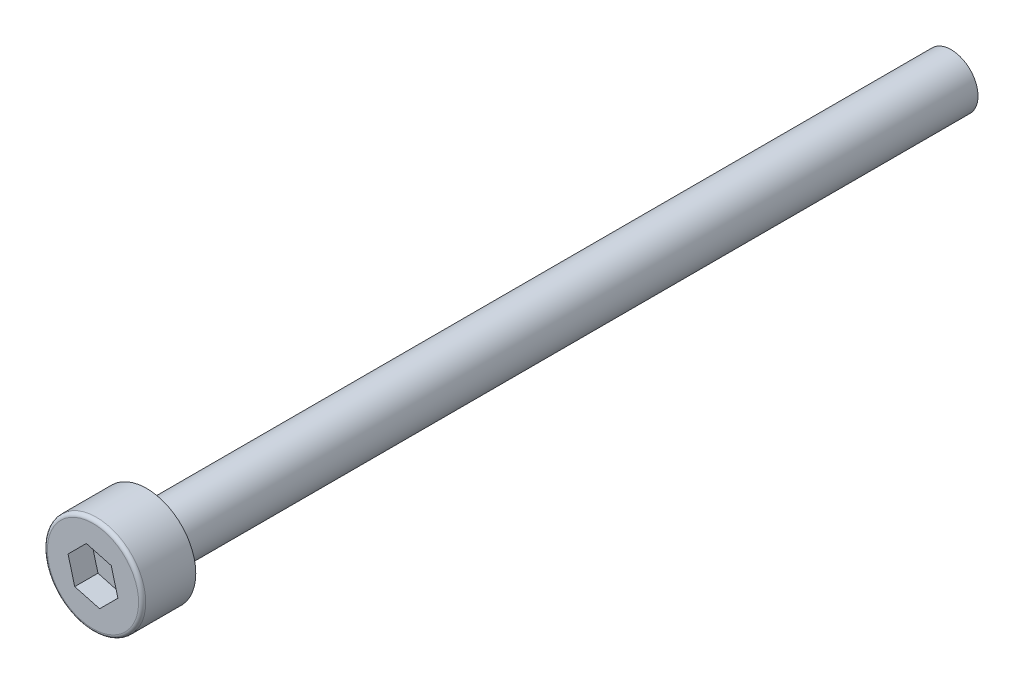
ISO-10303-21;
HEADER;
FILE_DESCRIPTION(('STEP AP214'),'2;1');
FILE_NAME('part.step','',(''),(''),'','','');
FILE_SCHEMA(('AUTOMOTIVE_DESIGN { 1 0 10303 214 1 1 1 1 }'));
ENDSEC;
DATA;
#1=APPLICATION_CONTEXT('core data for automotive mechanical design processes');
#2=APPLICATION_PROTOCOL_DEFINITION('international standard','automotive_design',2000,#1);
#3=PRODUCT_CONTEXT('',#1,'mechanical');
#4=PRODUCT('Part','Part','',(#3));
#5=PRODUCT_RELATED_PRODUCT_CATEGORY('part','',(#4));
#6=PRODUCT_DEFINITION_FORMATION('','',#4);
#7=PRODUCT_DEFINITION_CONTEXT('part definition',#1,'design');
#8=PRODUCT_DEFINITION('design','',#6,#7);
#9=PRODUCT_DEFINITION_SHAPE('','',#8);
#10=(LENGTH_UNIT() NAMED_UNIT(*) SI_UNIT(.MILLI.,.METRE.));
#11=(NAMED_UNIT(*) PLANE_ANGLE_UNIT() SI_UNIT($,.RADIAN.));
#12=(NAMED_UNIT(*) SI_UNIT($,.STERADIAN.) SOLID_ANGLE_UNIT());
#13=UNCERTAINTY_MEASURE_WITH_UNIT(LENGTH_MEASURE(1.E-05),#10,'distance_accuracy_value','');
#14=(GEOMETRIC_REPRESENTATION_CONTEXT(3) GLOBAL_UNCERTAINTY_ASSIGNED_CONTEXT((#13)) GLOBAL_UNIT_ASSIGNED_CONTEXT((#10,
#11,#12)) REPRESENTATION_CONTEXT('',''));
#15=CARTESIAN_POINT('',(0.,0.,0.));
#16=DIRECTION('',(0.,0.,1.));
#17=DIRECTION('',(1.,0.,0.));
#18=AXIS2_PLACEMENT_3D('',#15,#16,#17);
#19=CARTESIAN_POINT('',(0.,0.,0.));
#20=DIRECTION('',(0.,0.,1.));
#21=DIRECTION('',(1.,0.,0.));
#22=AXIS2_PLACEMENT_3D('',#19,#20,#21);
#23=PLANE('',#22);
#24=CARTESIAN_POINT('',(0.,0.,0.));
#25=DIRECTION('',(0.,0.,1.));
#26=DIRECTION('',(1.,0.,0.));
#27=AXIS2_PLACEMENT_3D('',#24,#25,#26);
#28=CIRCLE('',#27,2.75);
#29=CARTESIAN_POINT('',(2.75,0.,0.));
#30=VERTEX_POINT('',#29);
#31=EDGE_CURVE('E137',#30,#30,#28,.T.);
#32=ORIENTED_EDGE('',*,*,#31,.F.);
#33=EDGE_LOOP('',(#32));
#34=FACE_BOUND('',#33,.T.);
#35=CARTESIAN_POINT('',(0.,0.,0.));
#36=DIRECTION('',(0.,0.,1.));
#37=DIRECTION('',(1.,0.,0.));
#38=AXIS2_PLACEMENT_3D('',#35,#36,#37);
#39=CIRCLE('',#38,1.5);
#40=CARTESIAN_POINT('',(1.5,0.,0.));
#41=VERTEX_POINT('',#40);
#42=EDGE_CURVE('E145',#41,#41,#39,.F.);
#43=ORIENTED_EDGE('',*,*,#42,.F.);
#44=EDGE_LOOP('',(#43));
#45=FACE_BOUND('',#44,.T.);
#46=ADVANCED_FACE('F34',(#34,#45),#23,.F.);
#47=CARTESIAN_POINT('',(0.,0.,3.));
#48=DIRECTION('',(0.,0.,-1.));
#49=DIRECTION('',(-1.,0.,0.));
#50=AXIS2_PLACEMENT_3D('',#47,#48,#49);
#51=CYLINDRICAL_SURFACE('',#50,2.75);
#52=CARTESIAN_POINT('',(0.,0.,2.8));
#53=DIRECTION('',(0.,0.,1.));
#54=DIRECTION('',(1.,0.,0.));
#55=AXIS2_PLACEMENT_3D('',#52,#53,#54);
#56=CIRCLE('',#55,2.75);
#57=CARTESIAN_POINT('',(2.75,0.,2.8));
#58=VERTEX_POINT('',#57);
#59=EDGE_CURVE('E11',#58,#58,#56,.F.);
#60=ORIENTED_EDGE('',*,*,#59,.T.);
#61=EDGE_LOOP('',(#60));
#62=FACE_BOUND('',#61,.T.);
#63=ORIENTED_EDGE('',*,*,#31,.T.);
#64=EDGE_LOOP('',(#63));
#65=FACE_BOUND('',#64,.T.);
#66=ADVANCED_FACE('F164',(#62,#65),#51,.T.);
#67=CARTESIAN_POINT('',(0.,0.,3.));
#68=DIRECTION('',(0.,0.,1.));
#69=DIRECTION('',(1.,0.,0.));
#70=AXIS2_PLACEMENT_3D('',#67,#68,#69);
#71=PLANE('',#70);
#72=CARTESIAN_POINT('',(0.,0.,3.));
#73=DIRECTION('',(0.,0.,1.));
#74=DIRECTION('',(1.,0.,0.));
#75=AXIS2_PLACEMENT_3D('',#72,#73,#74);
#76=CIRCLE('',#75,2.55);
#77=CARTESIAN_POINT('',(2.55,0.,3.));
#78=VERTEX_POINT('',#77);
#79=EDGE_CURVE('E42',#78,#78,#76,.T.);
#80=ORIENTED_EDGE('',*,*,#79,.T.);
#81=EDGE_LOOP('',(#80));
#82=FACE_BOUND('',#81,.T.);
#83=DIRECTION('',(0.258819045102521,-0.965925826289068,0.));
#84=VECTOR('',#83,1.);
#85=CARTESIAN_POINT('',(-1.39419383956301,0.373573113403356,3.));
#86=LINE('',#85,#84);
#87=CARTESIAN_POINT('',(-1.39419383956301,0.373573113403356,3.));
#88=VERTEX_POINT('',#87);
#89=CARTESIAN_POINT('',(-1.02062072615966,-1.02062072615966,3.));
#90=VERTEX_POINT('',#89);
#91=EDGE_CURVE('E49',#88,#90,#86,.T.);
#92=ORIENTED_EDGE('',*,*,#91,.F.);
#93=DIRECTION('',(-0.707106781186548,-0.707106781186548,0.));
#94=VECTOR('',#93,1.);
#95=CARTESIAN_POINT('',(-0.373573113403355,1.39419383956301,3.));
#96=LINE('',#95,#94);
#97=CARTESIAN_POINT('',(-0.373573113403355,1.39419383956301,3.));
#98=VERTEX_POINT('',#97);
#99=EDGE_CURVE('E133',#98,#88,#96,.T.);
#100=ORIENTED_EDGE('',*,*,#99,.F.);
#101=DIRECTION('',(-0.965925826289068,0.258819045102521,0.));
#102=VECTOR('',#101,1.);
#103=CARTESIAN_POINT('',(1.02062072615966,1.02062072615966,3.));
#104=LINE('',#103,#102);
#105=CARTESIAN_POINT('',(1.02062072615966,1.02062072615966,3.));
#106=VERTEX_POINT('',#105);
#107=EDGE_CURVE('E131',#106,#98,#104,.T.);
#108=ORIENTED_EDGE('',*,*,#107,.F.);
#109=DIRECTION('',(-0.258819045102521,0.965925826289068,0.));
#110=VECTOR('',#109,1.);
#111=CARTESIAN_POINT('',(1.39419383956301,-0.373573113403355,3.));
#112=LINE('',#111,#110);
#113=CARTESIAN_POINT('',(1.39419383956301,-0.373573113403355,3.));
#114=VERTEX_POINT('',#113);
#115=EDGE_CURVE('E97',#114,#106,#112,.T.);
#116=ORIENTED_EDGE('',*,*,#115,.F.);
#117=DIRECTION('',(0.707106781186548,0.707106781186548,0.));
#118=VECTOR('',#117,1.);
#119=CARTESIAN_POINT('',(0.373573113403355,-1.39419383956301,3.));
#120=LINE('',#119,#118);
#121=CARTESIAN_POINT('',(0.373573113403355,-1.39419383956301,3.));
#122=VERTEX_POINT('',#121);
#123=EDGE_CURVE('E127',#122,#114,#120,.T.);
#124=ORIENTED_EDGE('',*,*,#123,.F.);
#125=DIRECTION('',(0.965925826289068,-0.258819045102521,0.));
#126=VECTOR('',#125,1.);
#127=CARTESIAN_POINT('',(-1.02062072615966,-1.02062072615966,3.));
#128=LINE('',#127,#126);
#129=EDGE_CURVE('E123',#90,#122,#128,.T.);
#130=ORIENTED_EDGE('',*,*,#129,.F.);
#131=EDGE_LOOP('',(#92,#100,#108,#116,#124,#130));
#132=FACE_BOUND('',#131,.T.);
#133=ADVANCED_FACE('F150',(#82,#132),#71,.T.);
#134=CARTESIAN_POINT('',(-1.39419383956301,0.373573113403356,1.7));
#135=DIRECTION('',(-0.965925826289068,-0.258819045102521,0.));
#136=DIRECTION('',(0.258819045102521,-0.965925826289068,0.));
#137=AXIS2_PLACEMENT_3D('',#134,#135,#136);
#138=PLANE('',#137);
#139=ORIENTED_EDGE('',*,*,#91,.T.);
#140=DIRECTION('',(0.,0.,1.));
#141=VECTOR('',#140,1.);
#142=CARTESIAN_POINT('',(-1.02062072615966,-1.02062072615966,1.7));
#143=LINE('',#142,#141);
#144=CARTESIAN_POINT('',(-1.02062072615966,-1.02062072615966,1.7));
#145=VERTEX_POINT('',#144);
#146=EDGE_CURVE('E79',#145,#90,#143,.T.);
#147=ORIENTED_EDGE('',*,*,#146,.F.);
#148=DIRECTION('',(0.258819045102521,-0.965925826289068,0.));
#149=VECTOR('',#148,1.);
#150=CARTESIAN_POINT('',(-1.39419383956301,0.373573113403356,1.7));
#151=LINE('',#150,#149);
#152=CARTESIAN_POINT('',(-1.39419383956301,0.373573113403356,1.7));
#153=VERTEX_POINT('',#152);
#154=EDGE_CURVE('E135',#153,#145,#151,.T.);
#155=ORIENTED_EDGE('',*,*,#154,.F.);
#156=DIRECTION('',(0.,0.,1.));
#157=VECTOR('',#156,1.);
#158=CARTESIAN_POINT('',(-1.39419383956301,0.373573113403356,1.7));
#159=LINE('',#158,#157);
#160=EDGE_CURVE('E57',#153,#88,#159,.T.);
#161=ORIENTED_EDGE('',*,*,#160,.T.);
#162=EDGE_LOOP('',(#139,#147,#155,#161));
#163=FACE_BOUND('',#162,.T.);
#164=ADVANCED_FACE('F176',(#163),#138,.F.);
#165=CARTESIAN_POINT('',(-0.373573113403355,1.39419383956301,1.7));
#166=DIRECTION('',(-0.707106781186548,0.707106781186548,0.));
#167=DIRECTION('',(-0.707106781186548,-0.707106781186548,0.));
#168=AXIS2_PLACEMENT_3D('',#165,#166,#167);
#169=PLANE('',#168);
#170=ORIENTED_EDGE('',*,*,#99,.T.);
#171=ORIENTED_EDGE('',*,*,#160,.F.);
#172=DIRECTION('',(-0.707106781186548,-0.707106781186548,0.));
#173=VECTOR('',#172,1.);
#174=CARTESIAN_POINT('',(-0.373573113403355,1.39419383956301,1.7));
#175=LINE('',#174,#173);
#176=CARTESIAN_POINT('',(-0.373573113403355,1.39419383956301,1.7));
#177=VERTEX_POINT('',#176);
#178=EDGE_CURVE('E109',#177,#153,#175,.T.);
#179=ORIENTED_EDGE('',*,*,#178,.F.);
#180=DIRECTION('',(0.,0.,1.));
#181=VECTOR('',#180,1.);
#182=CARTESIAN_POINT('',(-0.373573113403355,1.39419383956301,1.7));
#183=LINE('',#182,#181);
#184=EDGE_CURVE('E101',#177,#98,#183,.T.);
#185=ORIENTED_EDGE('',*,*,#184,.T.);
#186=EDGE_LOOP('',(#170,#171,#179,#185));
#187=FACE_BOUND('',#186,.T.);
#188=ADVANCED_FACE('F179',(#187),#169,.F.);
#189=CARTESIAN_POINT('',(1.02062072615966,1.02062072615966,1.7));
#190=DIRECTION('',(0.258819045102521,0.965925826289068,0.));
#191=DIRECTION('',(-0.965925826289068,0.258819045102521,0.));
#192=AXIS2_PLACEMENT_3D('',#189,#190,#191);
#193=PLANE('',#192);
#194=ORIENTED_EDGE('',*,*,#107,.T.);
#195=ORIENTED_EDGE('',*,*,#184,.F.);
#196=DIRECTION('',(-0.965925826289068,0.258819045102521,0.));
#197=VECTOR('',#196,1.);
#198=CARTESIAN_POINT('',(1.02062072615966,1.02062072615966,1.7));
#199=LINE('',#198,#197);
#200=CARTESIAN_POINT('',(1.02062072615966,1.02062072615966,1.7));
#201=VERTEX_POINT('',#200);
#202=EDGE_CURVE('E105',#201,#177,#199,.T.);
#203=ORIENTED_EDGE('',*,*,#202,.F.);
#204=DIRECTION('',(0.,0.,1.));
#205=VECTOR('',#204,1.);
#206=CARTESIAN_POINT('',(1.02062072615966,1.02062072615966,1.7));
#207=LINE('',#206,#205);
#208=EDGE_CURVE('E90',#201,#106,#207,.T.);
#209=ORIENTED_EDGE('',*,*,#208,.T.);
#210=EDGE_LOOP('',(#194,#195,#203,#209));
#211=FACE_BOUND('',#210,.T.);
#212=ADVANCED_FACE('F106',(#211),#193,.F.);
#213=CARTESIAN_POINT('',(1.39419383956301,-0.373573113403355,1.7));
#214=DIRECTION('',(0.965925826289068,0.258819045102521,0.));
#215=DIRECTION('',(-0.258819045102521,0.965925826289068,0.));
#216=AXIS2_PLACEMENT_3D('',#213,#214,#215);
#217=PLANE('',#216);
#218=ORIENTED_EDGE('',*,*,#115,.T.);
#219=ORIENTED_EDGE('',*,*,#208,.F.);
#220=DIRECTION('',(-0.258819045102521,0.965925826289068,0.));
#221=VECTOR('',#220,1.);
#222=CARTESIAN_POINT('',(1.39419383956301,-0.373573113403355,1.7));
#223=LINE('',#222,#221);
#224=CARTESIAN_POINT('',(1.39419383956301,-0.373573113403355,1.7));
#225=VERTEX_POINT('',#224);
#226=EDGE_CURVE('E94',#225,#201,#223,.T.);
#227=ORIENTED_EDGE('',*,*,#226,.F.);
#228=DIRECTION('',(0.,0.,1.));
#229=VECTOR('',#228,1.);
#230=CARTESIAN_POINT('',(1.39419383956301,-0.373573113403355,1.7));
#231=LINE('',#230,#229);
#232=EDGE_CURVE('E102',#225,#114,#231,.T.);
#233=ORIENTED_EDGE('',*,*,#232,.T.);
#234=EDGE_LOOP('',(#218,#219,#227,#233));
#235=FACE_BOUND('',#234,.T.);
#236=ADVANCED_FACE('F92',(#235),#217,.F.);
#237=CARTESIAN_POINT('',(0.373573113403355,-1.39419383956301,1.7));
#238=DIRECTION('',(0.707106781186548,-0.707106781186548,0.));
#239=DIRECTION('',(0.707106781186548,0.707106781186548,0.));
#240=AXIS2_PLACEMENT_3D('',#237,#238,#239);
#241=PLANE('',#240);
#242=ORIENTED_EDGE('',*,*,#123,.T.);
#243=ORIENTED_EDGE('',*,*,#232,.F.);
#244=DIRECTION('',(0.707106781186548,0.707106781186548,0.));
#245=VECTOR('',#244,1.);
#246=CARTESIAN_POINT('',(0.373573113403355,-1.39419383956301,1.7));
#247=LINE('',#246,#245);
#248=CARTESIAN_POINT('',(0.373573113403355,-1.39419383956301,1.7));
#249=VERTEX_POINT('',#248);
#250=EDGE_CURVE('E115',#249,#225,#247,.T.);
#251=ORIENTED_EDGE('',*,*,#250,.F.);
#252=DIRECTION('',(0.,0.,1.));
#253=VECTOR('',#252,1.);
#254=CARTESIAN_POINT('',(0.373573113403355,-1.39419383956301,1.7));
#255=LINE('',#254,#253);
#256=EDGE_CURVE('E140',#249,#122,#255,.T.);
#257=ORIENTED_EDGE('',*,*,#256,.T.);
#258=EDGE_LOOP('',(#242,#243,#251,#257));
#259=FACE_BOUND('',#258,.T.);
#260=ADVANCED_FACE('F183',(#259),#241,.F.);
#261=CARTESIAN_POINT('',(-1.02062072615966,-1.02062072615966,1.7));
#262=DIRECTION('',(-0.258819045102521,-0.965925826289068,0.));
#263=DIRECTION('',(0.965925826289068,-0.258819045102521,0.));
#264=AXIS2_PLACEMENT_3D('',#261,#262,#263);
#265=PLANE('',#264);
#266=ORIENTED_EDGE('',*,*,#129,.T.);
#267=ORIENTED_EDGE('',*,*,#256,.F.);
#268=DIRECTION('',(0.965925826289068,-0.258819045102521,0.));
#269=VECTOR('',#268,1.);
#270=CARTESIAN_POINT('',(-1.02062072615966,-1.02062072615966,1.7));
#271=LINE('',#270,#269);
#272=EDGE_CURVE('E117',#145,#249,#271,.T.);
#273=ORIENTED_EDGE('',*,*,#272,.F.);
#274=ORIENTED_EDGE('',*,*,#146,.T.);
#275=EDGE_LOOP('',(#266,#267,#273,#274));
#276=FACE_BOUND('',#275,.T.);
#277=ADVANCED_FACE('F180',(#276),#265,.F.);
#278=CARTESIAN_POINT('',(0.,0.,1.7));
#279=DIRECTION('',(0.,0.,1.));
#280=DIRECTION('',(1.,0.,0.));
#281=AXIS2_PLACEMENT_3D('',#278,#279,#280);
#282=PLANE('',#281);
#283=ORIENTED_EDGE('',*,*,#154,.T.);
#284=ORIENTED_EDGE('',*,*,#272,.T.);
#285=ORIENTED_EDGE('',*,*,#250,.T.);
#286=ORIENTED_EDGE('',*,*,#226,.T.);
#287=ORIENTED_EDGE('',*,*,#202,.T.);
#288=ORIENTED_EDGE('',*,*,#178,.T.);
#289=EDGE_LOOP('',(#283,#284,#285,#286,#287,#288));
#290=FACE_BOUND('',#289,.T.);
#291=ADVANCED_FACE('F112',(#290),#282,.T.);
#292=CARTESIAN_POINT('',(0.,0.,-45.));
#293=DIRECTION('',(0.,0.,1.));
#294=DIRECTION('',(1.,0.,0.));
#295=AXIS2_PLACEMENT_3D('',#292,#293,#294);
#296=CYLINDRICAL_SURFACE('',#295,1.5);
#297=CARTESIAN_POINT('',(0.,0.,-45.));
#298=DIRECTION('',(0.,0.,-1.));
#299=DIRECTION('',(-1.,0.,0.));
#300=AXIS2_PLACEMENT_3D('',#297,#298,#299);
#301=CIRCLE('',#300,1.5);
#302=CARTESIAN_POINT('',(1.5,0.,-45.));
#303=VERTEX_POINT('',#302);
#304=EDGE_CURVE('E124',#303,#303,#301,.T.);
#305=CARTESIAN_POINT('',(1.5,0.,-45.));
#306=CARTESIAN_POINT('',(1.5,0.,-44.53125));
#307=CARTESIAN_POINT('',(1.5,0.,-44.0625));
#308=CARTESIAN_POINT('',(1.5,0.,-43.125));
#309=CARTESIAN_POINT('',(1.5,0.,-42.65625));
#310=CARTESIAN_POINT('',(1.5,0.,-41.71875));
#311=CARTESIAN_POINT('',(1.5,0.,-41.25));
#312=CARTESIAN_POINT('',(1.5,0.,-40.3125));
#313=CARTESIAN_POINT('',(1.5,0.,-39.84375));
#314=CARTESIAN_POINT('',(1.5,0.,-38.90625));
#315=CARTESIAN_POINT('',(1.5,0.,-38.4375));
#316=CARTESIAN_POINT('',(1.5,0.,-37.5));
#317=CARTESIAN_POINT('',(1.5,0.,-37.03125));
#318=CARTESIAN_POINT('',(1.5,0.,-36.09375));
#319=CARTESIAN_POINT('',(1.5,0.,-35.625));
#320=CARTESIAN_POINT('',(1.5,0.,-34.6875));
#321=CARTESIAN_POINT('',(1.5,0.,-34.21875));
#322=CARTESIAN_POINT('',(1.5,0.,-33.28125));
#323=CARTESIAN_POINT('',(1.5,0.,-32.8125));
#324=CARTESIAN_POINT('',(1.5,0.,-31.875));
#325=CARTESIAN_POINT('',(1.5,0.,-31.40625));
#326=CARTESIAN_POINT('',(1.5,0.,-30.46875));
#327=CARTESIAN_POINT('',(1.5,0.,-30.));
#328=CARTESIAN_POINT('',(1.5,0.,-29.0625));
#329=CARTESIAN_POINT('',(1.5,0.,-28.59375));
#330=CARTESIAN_POINT('',(1.5,0.,-27.65625));
#331=CARTESIAN_POINT('',(1.5,0.,-27.1875));
#332=CARTESIAN_POINT('',(1.5,0.,-26.25));
#333=CARTESIAN_POINT('',(1.5,0.,-25.78125));
#334=CARTESIAN_POINT('',(1.5,0.,-24.84375));
#335=CARTESIAN_POINT('',(1.5,0.,-24.375));
#336=CARTESIAN_POINT('',(1.5,0.,-23.4375));
#337=CARTESIAN_POINT('',(1.5,0.,-22.96875));
#338=CARTESIAN_POINT('',(1.5,0.,-22.03125));
#339=CARTESIAN_POINT('',(1.5,0.,-21.5625));
#340=CARTESIAN_POINT('',(1.5,0.,-20.625));
#341=CARTESIAN_POINT('',(1.5,0.,-20.15625));
#342=CARTESIAN_POINT('',(1.5,0.,-19.21875));
#343=CARTESIAN_POINT('',(1.5,0.,-18.75));
#344=CARTESIAN_POINT('',(1.5,0.,-17.8125));
#345=CARTESIAN_POINT('',(1.5,0.,-17.34375));
#346=CARTESIAN_POINT('',(1.5,0.,-16.40625));
#347=CARTESIAN_POINT('',(1.5,0.,-15.9375));
#348=CARTESIAN_POINT('',(1.5,0.,-15.));
#349=CARTESIAN_POINT('',(1.5,0.,-14.53125));
#350=CARTESIAN_POINT('',(1.5,0.,-13.59375));
#351=CARTESIAN_POINT('',(1.5,0.,-13.125));
#352=CARTESIAN_POINT('',(1.5,0.,-12.1875));
#353=CARTESIAN_POINT('',(1.5,0.,-11.71875));
#354=CARTESIAN_POINT('',(1.5,0.,-10.78125));
#355=CARTESIAN_POINT('',(1.5,0.,-10.3125));
#356=CARTESIAN_POINT('',(1.5,0.,-9.37500000000001));
#357=CARTESIAN_POINT('',(1.5,0.,-8.90625000000001));
#358=CARTESIAN_POINT('',(1.5,0.,-7.96875000000001));
#359=CARTESIAN_POINT('',(1.5,0.,-7.5));
#360=CARTESIAN_POINT('',(1.5,0.,-6.5625));
#361=CARTESIAN_POINT('',(1.5,0.,-6.09375));
#362=CARTESIAN_POINT('',(1.5,0.,-5.15625000000001));
#363=CARTESIAN_POINT('',(1.5,0.,-4.68750000000001));
#364=CARTESIAN_POINT('',(1.5,0.,-3.75000000000001));
#365=CARTESIAN_POINT('',(1.5,0.,-3.28125000000001));
#366=CARTESIAN_POINT('',(1.5,0.,-2.34375000000001));
#367=CARTESIAN_POINT('',(1.5,0.,-1.87500000000001));
#368=CARTESIAN_POINT('',(1.5,0.,-0.937500000000006));
#369=CARTESIAN_POINT('',(1.5,0.,-0.468750000000007));
#370=CARTESIAN_POINT('',(1.5,0.,0.));
#371=B_SPLINE_CURVE_WITH_KNOTS('',3,(#305,#306,#307,#308,#309,#310,#311,#312,#313,#314,#315,
#316,#317,#318,#319,#320,#321,#322,#323,#324,#325,#326,#327,#328,#329,#330,#331,#332,#333,#334,
#335,#336,#337,#338,#339,#340,#341,#342,#343,#344,#345,#346,#347,#348,#349,#350,#351,#352,#353,
#354,#355,#356,#357,#358,#359,#360,#361,#362,#363,#364,#365,#366,#367,#368,#369,#370),
.UNSPECIFIED.,.F.,.F.,(4,2,2,2,2,2,2,2,2,2,2,2,2,2,2,2,2,2,2,2,2,2,2,2,2,2,2,2,2,2,2,2,4),(0.,
1.40625,2.8125,4.21874999999999,5.625,7.03125,8.43749999999999,9.84374999999999,11.25,12.65625,
14.0625,15.46875,16.875,18.28125,19.6875,21.09375,22.5,23.90625,25.3125,26.71875,28.125,
29.53125,30.9375,32.34375,33.75,35.15625,36.5625,37.96875,39.375,40.78125,42.1875,43.59375,45.),.UNSPECIFIED.);
#372=EDGE_CURVE('BSEAM159',#303,#41,#371,.T.);
#373=ORIENTED_EDGE('',*,*,#304,.F.);
#374=ORIENTED_EDGE('',*,*,#42,.T.);
#375=ORIENTED_EDGE('',*,*,#372,.T.);
#376=ORIENTED_EDGE('',*,*,#372,.F.);
#377=EDGE_LOOP('',(#373,#375,#374,#376));
#378=FACE_BOUND('',#377,.T.);
#379=ADVANCED_FACE('F159',(#378),#296,.T.);
#380=CARTESIAN_POINT('',(0.,0.,-45.));
#381=DIRECTION('',(0.,0.,-1.));
#382=DIRECTION('',(-1.,0.,0.));
#383=AXIS2_PLACEMENT_3D('',#380,#381,#382);
#384=PLANE('',#383);
#385=ORIENTED_EDGE('',*,*,#304,.T.);
#386=EDGE_LOOP('',(#385));
#387=FACE_BOUND('',#386,.T.);
#388=ADVANCED_FACE('F154',(#387),#384,.T.);
#389=CARTESIAN_POINT('',(0.,0.,2.8));
#390=DIRECTION('',(0.,0.,1.));
#391=DIRECTION('',(1.,0.,0.));
#392=AXIS2_PLACEMENT_3D('',#389,#390,#391);
#393=TOROIDAL_SURFACE('',#392,2.55,0.2);
#394=ORIENTED_EDGE('',*,*,#59,.F.);
#395=EDGE_LOOP('',(#394));
#396=FACE_BOUND('',#395,.T.);
#397=ORIENTED_EDGE('',*,*,#79,.F.);
#398=EDGE_LOOP('',(#397));
#399=FACE_BOUND('',#398,.T.);
#400=ADVANCED_FACE('F36',(#396,#399),#393,.T.);
#401=CLOSED_SHELL('',(#46,#66,#133,#164,#188,#212,#236,#260,#277,#291,#379,#388,#400));
#402=MANIFOLD_SOLID_BREP('B2',#401);
#403=ADVANCED_BREP_SHAPE_REPRESENTATION('',(#18,#402),#14);
#404=SHAPE_DEFINITION_REPRESENTATION(#9,#403);
ENDSEC;
END-ISO-10303-21;
